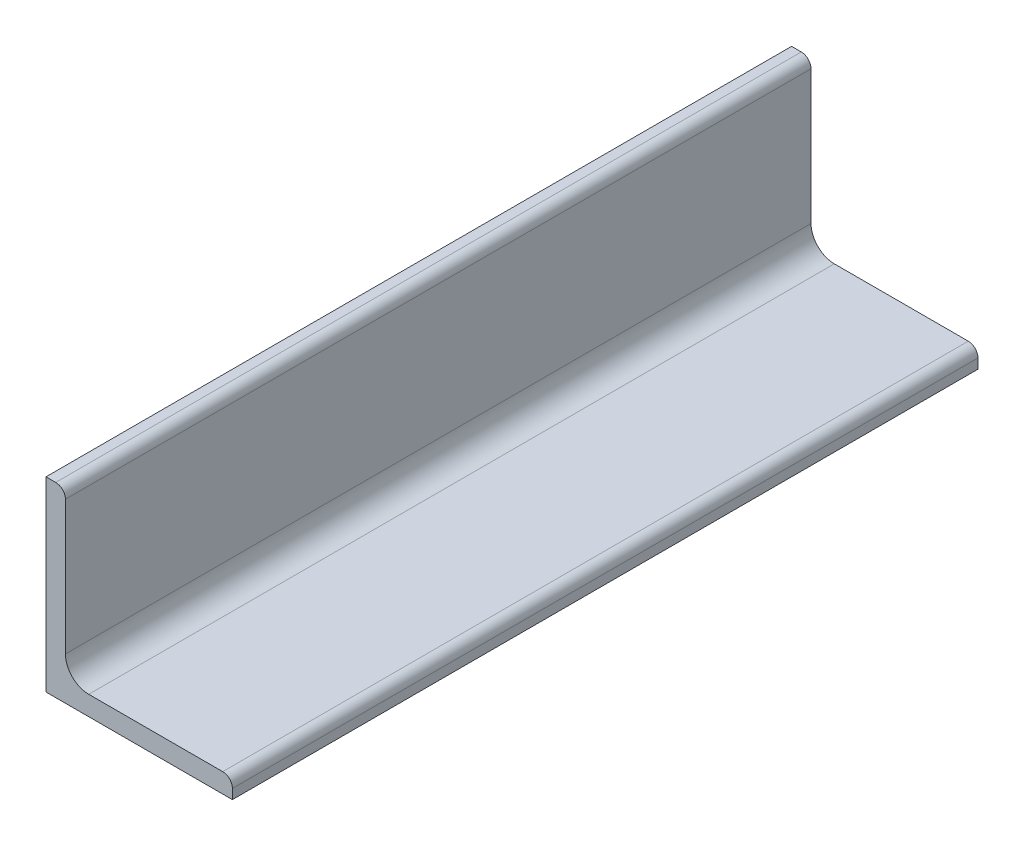
ISO-10303-21;
HEADER;
FILE_DESCRIPTION(('STEP AP214'),'2;1');
FILE_NAME('part.step','',(''),(''),'','','');
FILE_SCHEMA(('AUTOMOTIVE_DESIGN { 1 0 10303 214 1 1 1 1 }'));
ENDSEC;
DATA;
#1=APPLICATION_CONTEXT('core data for automotive mechanical design processes');
#2=APPLICATION_PROTOCOL_DEFINITION('international standard','automotive_design',2000,#1);
#3=PRODUCT_CONTEXT('',#1,'mechanical');
#4=PRODUCT('Part','Part','',(#3));
#5=PRODUCT_RELATED_PRODUCT_CATEGORY('part','',(#4));
#6=PRODUCT_DEFINITION_FORMATION('','',#4);
#7=PRODUCT_DEFINITION_CONTEXT('part definition',#1,'design');
#8=PRODUCT_DEFINITION('design','',#6,#7);
#9=PRODUCT_DEFINITION_SHAPE('','',#8);
#10=(LENGTH_UNIT() NAMED_UNIT(*) SI_UNIT(.MILLI.,.METRE.));
#11=(NAMED_UNIT(*) PLANE_ANGLE_UNIT() SI_UNIT($,.RADIAN.));
#12=(NAMED_UNIT(*) SI_UNIT($,.STERADIAN.) SOLID_ANGLE_UNIT());
#13=UNCERTAINTY_MEASURE_WITH_UNIT(LENGTH_MEASURE(1.E-05),#10,'distance_accuracy_value','');
#14=(GEOMETRIC_REPRESENTATION_CONTEXT(3) GLOBAL_UNCERTAINTY_ASSIGNED_CONTEXT((#13)) GLOBAL_UNIT_ASSIGNED_CONTEXT((#10,
#11,#12)) REPRESENTATION_CONTEXT('',''));
#15=CARTESIAN_POINT('',(0.,0.,0.));
#16=DIRECTION('',(0.,0.,1.));
#17=DIRECTION('',(1.,0.,0.));
#18=AXIS2_PLACEMENT_3D('',#15,#16,#17);
#19=CARTESIAN_POINT('',(0.490776827053332,76.2882459217981,304.8));
#20=DIRECTION('',(1.,0.,0.));
#21=DIRECTION('',(0.,0.,-1.));
#22=AXIS2_PLACEMENT_3D('',#19,#20,#21);
#23=PLANE('',#22);
#24=DIRECTION('',(0.,-1.,0.));
#25=VECTOR('',#24,1.);
#26=CARTESIAN_POINT('',(0.490776827053332,76.2882459217981,0.));
#27=LINE('',#26,#25);
#28=CARTESIAN_POINT('',(0.490776827053332,76.2882459217981,0.));
#29=VERTEX_POINT('',#28);
#30=CARTESIAN_POINT('',(0.490776827053332,0.0882459217980795,0.));
#31=VERTEX_POINT('',#30);
#32=EDGE_CURVE('E135',#29,#31,#27,.T.);
#33=ORIENTED_EDGE('',*,*,#32,.T.);
#34=DIRECTION('',(0.,0.,-1.));
#35=VECTOR('',#34,1.);
#36=CARTESIAN_POINT('',(0.490776827053332,0.0882459217980795,304.8));
#37=LINE('',#36,#35);
#38=CARTESIAN_POINT('',(0.490776827053332,0.0882459217980795,304.8));
#39=VERTEX_POINT('',#38);
#40=EDGE_CURVE('E11',#39,#31,#37,.T.);
#41=ORIENTED_EDGE('',*,*,#40,.F.);
#42=DIRECTION('',(0.,-1.,0.));
#43=VECTOR('',#42,1.);
#44=CARTESIAN_POINT('',(0.490776827053332,76.2882459217981,304.8));
#45=LINE('',#44,#43);
#46=CARTESIAN_POINT('',(0.490776827053332,76.2882459217981,304.8));
#47=VERTEX_POINT('',#46);
#48=EDGE_CURVE('E151',#47,#39,#45,.T.);
#49=ORIENTED_EDGE('',*,*,#48,.F.);
#50=DIRECTION('',(0.,0.,-1.));
#51=VECTOR('',#50,1.);
#52=CARTESIAN_POINT('',(0.490776827053332,76.2882459217981,304.8));
#53=LINE('',#52,#51);
#54=EDGE_CURVE('E131',#47,#29,#53,.T.);
#55=ORIENTED_EDGE('',*,*,#54,.T.);
#56=EDGE_LOOP('',(#33,#41,#49,#55));
#57=FACE_BOUND('',#56,.T.);
#58=ADVANCED_FACE('F33',(#57),#23,.F.);
#59=CARTESIAN_POINT('',(0.490776827053332,0.0882459217980795,304.8));
#60=DIRECTION('',(0.,1.,0.));
#61=DIRECTION('',(0.,0.,1.));
#62=AXIS2_PLACEMENT_3D('',#59,#60,#61);
#63=PLANE('',#62);
#64=DIRECTION('',(1.,0.,0.));
#65=VECTOR('',#64,1.);
#66=CARTESIAN_POINT('',(0.490776827053332,0.0882459217980795,0.));
#67=LINE('',#66,#65);
#68=CARTESIAN_POINT('',(76.6907768270533,0.0882459217980795,0.));
#69=VERTEX_POINT('',#68);
#70=EDGE_CURVE('E138',#31,#69,#67,.T.);
#71=ORIENTED_EDGE('',*,*,#70,.T.);
#72=DIRECTION('',(0.,0.,-1.));
#73=VECTOR('',#72,1.);
#74=CARTESIAN_POINT('',(76.6907768270533,0.0882459217980795,304.8));
#75=LINE('',#74,#73);
#76=CARTESIAN_POINT('',(76.6907768270533,0.0882459217980795,304.8));
#77=VERTEX_POINT('',#76);
#78=EDGE_CURVE('E41',#77,#69,#75,.T.);
#79=ORIENTED_EDGE('',*,*,#78,.F.);
#80=DIRECTION('',(1.,0.,0.));
#81=VECTOR('',#80,1.);
#82=CARTESIAN_POINT('',(0.490776827053332,0.0882459217980795,304.8));
#83=LINE('',#82,#81);
#84=EDGE_CURVE('E95',#39,#77,#83,.T.);
#85=ORIENTED_EDGE('',*,*,#84,.F.);
#86=ORIENTED_EDGE('',*,*,#40,.T.);
#87=EDGE_LOOP('',(#71,#79,#85,#86));
#88=FACE_BOUND('',#87,.T.);
#89=ADVANCED_FACE('F194',(#88),#63,.F.);
#90=CARTESIAN_POINT('',(76.6907768270533,0.0882459217980795,304.8));
#91=DIRECTION('',(-1.,0.,0.));
#92=DIRECTION('',(0.,0.,1.));
#93=AXIS2_PLACEMENT_3D('',#90,#91,#92);
#94=PLANE('',#93);
#95=DIRECTION('',(0.,1.,0.));
#96=VECTOR('',#95,1.);
#97=CARTESIAN_POINT('',(76.6907768270533,0.0882459217980795,0.));
#98=LINE('',#97,#96);
#99=CARTESIAN_POINT('',(76.6907768270533,4.05699592179808,0.));
#100=VERTEX_POINT('',#99);
#101=EDGE_CURVE('E140',#69,#100,#98,.T.);
#102=ORIENTED_EDGE('',*,*,#101,.T.);
#103=DIRECTION('',(0.,0.,-1.));
#104=VECTOR('',#103,1.);
#105=CARTESIAN_POINT('',(76.6907768270533,4.05699592179808,304.8));
#106=LINE('',#105,#104);
#107=CARTESIAN_POINT('',(76.6907768270533,4.05699592179808,304.8));
#108=VERTEX_POINT('',#107);
#109=EDGE_CURVE('E161',#108,#100,#106,.T.);
#110=ORIENTED_EDGE('',*,*,#109,.F.);
#111=DIRECTION('',(0.,1.,0.));
#112=VECTOR('',#111,1.);
#113=CARTESIAN_POINT('',(76.6907768270533,0.0882459217980795,304.8));
#114=LINE('',#113,#112);
#115=EDGE_CURVE('E169',#77,#108,#114,.T.);
#116=ORIENTED_EDGE('',*,*,#115,.F.);
#117=ORIENTED_EDGE('',*,*,#78,.T.);
#118=EDGE_LOOP('',(#102,#110,#116,#117));
#119=FACE_BOUND('',#118,.T.);
#120=ADVANCED_FACE('F167',(#119),#94,.F.);
#121=CARTESIAN_POINT('',(72.7220268270533,4.05699592179808,304.8));
#122=DIRECTION('',(0.,0.,-1.));
#123=DIRECTION('',(-1.,0.,0.));
#124=AXIS2_PLACEMENT_3D('',#121,#122,#123);
#125=CYLINDRICAL_SURFACE('',#124,3.96875000000001);
#126=CARTESIAN_POINT('',(72.7220268270533,4.05699592179808,0.));
#127=DIRECTION('',(0.,0.,1.));
#128=DIRECTION('',(1.,0.,0.));
#129=AXIS2_PLACEMENT_3D('',#126,#127,#128);
#130=CIRCLE('',#129,3.96875000000001);
#131=CARTESIAN_POINT('',(72.7220268270533,8.02574592179808,0.));
#132=VERTEX_POINT('',#131);
#133=EDGE_CURVE('E142',#100,#132,#130,.T.);
#134=ORIENTED_EDGE('',*,*,#133,.T.);
#135=DIRECTION('',(0.,0.,-1.));
#136=VECTOR('',#135,1.);
#137=CARTESIAN_POINT('',(72.7220268270533,8.02574592179808,304.8));
#138=LINE('',#137,#136);
#139=CARTESIAN_POINT('',(72.7220268270533,8.02574592179808,304.8));
#140=VERTEX_POINT('',#139);
#141=EDGE_CURVE('E158',#140,#132,#138,.T.);
#142=ORIENTED_EDGE('',*,*,#141,.F.);
#143=CARTESIAN_POINT('',(72.7220268270533,4.05699592179808,304.8));
#144=DIRECTION('',(0.,0.,1.));
#145=DIRECTION('',(1.,0.,0.));
#146=AXIS2_PLACEMENT_3D('',#143,#144,#145);
#147=CIRCLE('',#146,3.96875000000001);
#148=EDGE_CURVE('E185',#108,#140,#147,.T.);
#149=ORIENTED_EDGE('',*,*,#148,.F.);
#150=ORIENTED_EDGE('',*,*,#109,.T.);
#151=EDGE_LOOP('',(#134,#142,#149,#150));
#152=FACE_BOUND('',#151,.T.);
#153=ADVANCED_FACE('F178',(#152),#125,.T.);
#154=CARTESIAN_POINT('',(72.7220268270533,8.02574592179808,304.8));
#155=DIRECTION('',(0.,-1.,0.));
#156=DIRECTION('',(0.,0.,-1.));
#157=AXIS2_PLACEMENT_3D('',#154,#155,#156);
#158=PLANE('',#157);
#159=DIRECTION('',(-1.,0.,0.));
#160=VECTOR('',#159,1.);
#161=CARTESIAN_POINT('',(72.7220268270533,8.02574592179808,0.));
#162=LINE('',#161,#160);
#163=CARTESIAN_POINT('',(17.9532768270533,8.02574592179808,0.));
#164=VERTEX_POINT('',#163);
#165=EDGE_CURVE('E144',#132,#164,#162,.T.);
#166=ORIENTED_EDGE('',*,*,#165,.T.);
#167=DIRECTION('',(0.,0.,-1.));
#168=VECTOR('',#167,1.);
#169=CARTESIAN_POINT('',(17.9532768270533,8.02574592179808,304.8));
#170=LINE('',#169,#168);
#171=CARTESIAN_POINT('',(17.9532768270533,8.02574592179808,304.8));
#172=VERTEX_POINT('',#171);
#173=EDGE_CURVE('E155',#172,#164,#170,.T.);
#174=ORIENTED_EDGE('',*,*,#173,.F.);
#175=DIRECTION('',(-1.,0.,0.));
#176=VECTOR('',#175,1.);
#177=CARTESIAN_POINT('',(72.7220268270533,8.02574592179808,304.8));
#178=LINE('',#177,#176);
#179=EDGE_CURVE('E184',#140,#172,#178,.T.);
#180=ORIENTED_EDGE('',*,*,#179,.F.);
#181=ORIENTED_EDGE('',*,*,#141,.T.);
#182=EDGE_LOOP('',(#166,#174,#180,#181));
#183=FACE_BOUND('',#182,.T.);
#184=ADVANCED_FACE('F182',(#183),#158,.F.);
#185=CARTESIAN_POINT('',(17.9532768270533,17.5507459217981,304.8));
#186=DIRECTION('',(0.,0.,-1.));
#187=DIRECTION('',(-1.,0.,0.));
#188=AXIS2_PLACEMENT_3D('',#185,#186,#187);
#189=CYLINDRICAL_SURFACE('',#188,9.52499999999999);
#190=CARTESIAN_POINT('',(17.9532768270533,17.5507459217981,0.));
#191=DIRECTION('',(0.,0.,-1.));
#192=DIRECTION('',(1.,0.,0.));
#193=AXIS2_PLACEMENT_3D('',#190,#191,#192);
#194=CIRCLE('',#193,9.52499999999999);
#195=CARTESIAN_POINT('',(8.42827682705333,17.5507459217981,0.));
#196=VERTEX_POINT('',#195);
#197=EDGE_CURVE('E146',#164,#196,#194,.T.);
#198=ORIENTED_EDGE('',*,*,#197,.T.);
#199=DIRECTION('',(0.,0.,-1.));
#200=VECTOR('',#199,1.);
#201=CARTESIAN_POINT('',(8.42827682705333,17.5507459217981,304.8));
#202=LINE('',#201,#200);
#203=CARTESIAN_POINT('',(8.42827682705333,17.5507459217981,304.8));
#204=VERTEX_POINT('',#203);
#205=EDGE_CURVE('E126',#204,#196,#202,.T.);
#206=ORIENTED_EDGE('',*,*,#205,.F.);
#207=CARTESIAN_POINT('',(17.9532768270533,17.5507459217981,304.8));
#208=DIRECTION('',(0.,0.,-1.));
#209=DIRECTION('',(1.,0.,0.));
#210=AXIS2_PLACEMENT_3D('',#207,#208,#209);
#211=CIRCLE('',#210,9.52499999999999);
#212=EDGE_CURVE('E117',#172,#204,#211,.T.);
#213=ORIENTED_EDGE('',*,*,#212,.F.);
#214=ORIENTED_EDGE('',*,*,#173,.T.);
#215=EDGE_LOOP('',(#198,#206,#213,#214));
#216=FACE_BOUND('',#215,.T.);
#217=ADVANCED_FACE('F206',(#216),#189,.F.);
#218=CARTESIAN_POINT('',(8.42827682705333,17.5507459217981,304.8));
#219=DIRECTION('',(-1.,0.,0.));
#220=DIRECTION('',(0.,0.,1.));
#221=AXIS2_PLACEMENT_3D('',#218,#219,#220);
#222=PLANE('',#221);
#223=DIRECTION('',(0.,1.,0.));
#224=VECTOR('',#223,1.);
#225=CARTESIAN_POINT('',(8.42827682705333,17.5507459217981,0.));
#226=LINE('',#225,#224);
#227=CARTESIAN_POINT('',(8.42827682705333,72.3194959217981,0.));
#228=VERTEX_POINT('',#227);
#229=EDGE_CURVE('E125',#196,#228,#226,.T.);
#230=ORIENTED_EDGE('',*,*,#229,.T.);
#231=DIRECTION('',(0.,0.,-1.));
#232=VECTOR('',#231,1.);
#233=CARTESIAN_POINT('',(8.42827682705333,72.3194959217981,304.8));
#234=LINE('',#233,#232);
#235=CARTESIAN_POINT('',(8.42827682705333,72.3194959217981,304.8));
#236=VERTEX_POINT('',#235);
#237=EDGE_CURVE('E122',#236,#228,#234,.T.);
#238=ORIENTED_EDGE('',*,*,#237,.F.);
#239=DIRECTION('',(0.,1.,0.));
#240=VECTOR('',#239,1.);
#241=CARTESIAN_POINT('',(8.42827682705333,17.5507459217981,304.8));
#242=LINE('',#241,#240);
#243=EDGE_CURVE('E111',#204,#236,#242,.T.);
#244=ORIENTED_EDGE('',*,*,#243,.F.);
#245=ORIENTED_EDGE('',*,*,#205,.T.);
#246=EDGE_LOOP('',(#230,#238,#244,#245));
#247=FACE_BOUND('',#246,.T.);
#248=ADVANCED_FACE('F123',(#247),#222,.F.);
#249=CARTESIAN_POINT('',(4.45952682705333,72.3194959217981,304.8));
#250=DIRECTION('',(0.,0.,-1.));
#251=DIRECTION('',(-1.,0.,0.));
#252=AXIS2_PLACEMENT_3D('',#249,#250,#251);
#253=CYLINDRICAL_SURFACE('',#252,3.96875);
#254=CARTESIAN_POINT('',(4.45952682705333,72.3194959217981,0.));
#255=DIRECTION('',(0.,0.,1.));
#256=DIRECTION('',(1.,0.,0.));
#257=AXIS2_PLACEMENT_3D('',#254,#255,#256);
#258=CIRCLE('',#257,3.96875);
#259=CARTESIAN_POINT('',(4.45952682705333,76.2882459217981,0.));
#260=VERTEX_POINT('',#259);
#261=EDGE_CURVE('E81',#228,#260,#258,.T.);
#262=ORIENTED_EDGE('',*,*,#261,.T.);
#263=DIRECTION('',(0.,0.,-1.));
#264=VECTOR('',#263,1.);
#265=CARTESIAN_POINT('',(4.45952682705333,76.2882459217981,304.8));
#266=LINE('',#265,#264);
#267=CARTESIAN_POINT('',(4.45952682705333,76.2882459217981,304.8));
#268=VERTEX_POINT('',#267);
#269=EDGE_CURVE('E127',#268,#260,#266,.T.);
#270=ORIENTED_EDGE('',*,*,#269,.F.);
#271=CARTESIAN_POINT('',(4.45952682705333,72.3194959217981,304.8));
#272=DIRECTION('',(0.,0.,1.));
#273=DIRECTION('',(1.,0.,0.));
#274=AXIS2_PLACEMENT_3D('',#271,#272,#273);
#275=CIRCLE('',#274,3.96875);
#276=EDGE_CURVE('E115',#236,#268,#275,.T.);
#277=ORIENTED_EDGE('',*,*,#276,.F.);
#278=ORIENTED_EDGE('',*,*,#237,.T.);
#279=EDGE_LOOP('',(#262,#270,#277,#278));
#280=FACE_BOUND('',#279,.T.);
#281=ADVANCED_FACE('F129',(#280),#253,.T.);
#282=CARTESIAN_POINT('',(4.45952682705333,76.2882459217981,304.8));
#283=DIRECTION('',(0.,-1.,0.));
#284=DIRECTION('',(0.,0.,-1.));
#285=AXIS2_PLACEMENT_3D('',#282,#283,#284);
#286=PLANE('',#285);
#287=DIRECTION('',(-1.,0.,0.));
#288=VECTOR('',#287,1.);
#289=CARTESIAN_POINT('',(4.45952682705333,76.2882459217981,0.));
#290=LINE('',#289,#288);
#291=EDGE_CURVE('E87',#260,#29,#290,.T.);
#292=ORIENTED_EDGE('',*,*,#291,.T.);
#293=ORIENTED_EDGE('',*,*,#54,.F.);
#294=DIRECTION('',(-1.,0.,0.));
#295=VECTOR('',#294,1.);
#296=CARTESIAN_POINT('',(4.45952682705333,76.2882459217981,304.8));
#297=LINE('',#296,#295);
#298=EDGE_CURVE('E49',#268,#47,#297,.T.);
#299=ORIENTED_EDGE('',*,*,#298,.F.);
#300=ORIENTED_EDGE('',*,*,#269,.T.);
#301=EDGE_LOOP('',(#292,#293,#299,#300));
#302=FACE_BOUND('',#301,.T.);
#303=ADVANCED_FACE('F214',(#302),#286,.F.);
#304=CARTESIAN_POINT('',(72.7220268270533,4.05699592179808,304.8));
#305=DIRECTION('',(0.,0.,1.));
#306=DIRECTION('',(1.,0.,0.));
#307=AXIS2_PLACEMENT_3D('',#304,#305,#306);
#308=PLANE('',#307);
#309=ORIENTED_EDGE('',*,*,#48,.T.);
#310=ORIENTED_EDGE('',*,*,#84,.T.);
#311=ORIENTED_EDGE('',*,*,#115,.T.);
#312=ORIENTED_EDGE('',*,*,#148,.T.);
#313=ORIENTED_EDGE('',*,*,#179,.T.);
#314=ORIENTED_EDGE('',*,*,#212,.T.);
#315=ORIENTED_EDGE('',*,*,#243,.T.);
#316=ORIENTED_EDGE('',*,*,#276,.T.);
#317=ORIENTED_EDGE('',*,*,#298,.T.);
#318=EDGE_LOOP('',(#309,#310,#311,#312,#313,#314,#315,#316,#317));
#319=FACE_BOUND('',#318,.T.);
#320=ADVANCED_FACE('F113',(#319),#308,.T.);
#321=CARTESIAN_POINT('',(72.7220268270533,4.05699592179808,0.));
#322=DIRECTION('',(0.,0.,1.));
#323=DIRECTION('',(1.,0.,0.));
#324=AXIS2_PLACEMENT_3D('',#321,#322,#323);
#325=PLANE('',#324);
#326=ORIENTED_EDGE('',*,*,#32,.F.);
#327=ORIENTED_EDGE('',*,*,#291,.F.);
#328=ORIENTED_EDGE('',*,*,#261,.F.);
#329=ORIENTED_EDGE('',*,*,#229,.F.);
#330=ORIENTED_EDGE('',*,*,#197,.F.);
#331=ORIENTED_EDGE('',*,*,#165,.F.);
#332=ORIENTED_EDGE('',*,*,#133,.F.);
#333=ORIENTED_EDGE('',*,*,#101,.F.);
#334=ORIENTED_EDGE('',*,*,#70,.F.);
#335=EDGE_LOOP('',(#326,#327,#328,#329,#330,#331,#332,#333,#334));
#336=FACE_BOUND('',#335,.T.);
#337=ADVANCED_FACE('F173',(#336),#325,.F.);
#338=CLOSED_SHELL('',(#58,#89,#120,#153,#184,#217,#248,#281,#303,#320,#337));
#339=MANIFOLD_SOLID_BREP('B2',#338);
#340=ADVANCED_BREP_SHAPE_REPRESENTATION('',(#18,#339),#14);
#341=SHAPE_DEFINITION_REPRESENTATION(#9,#340);
ENDSEC;
END-ISO-10303-21;
